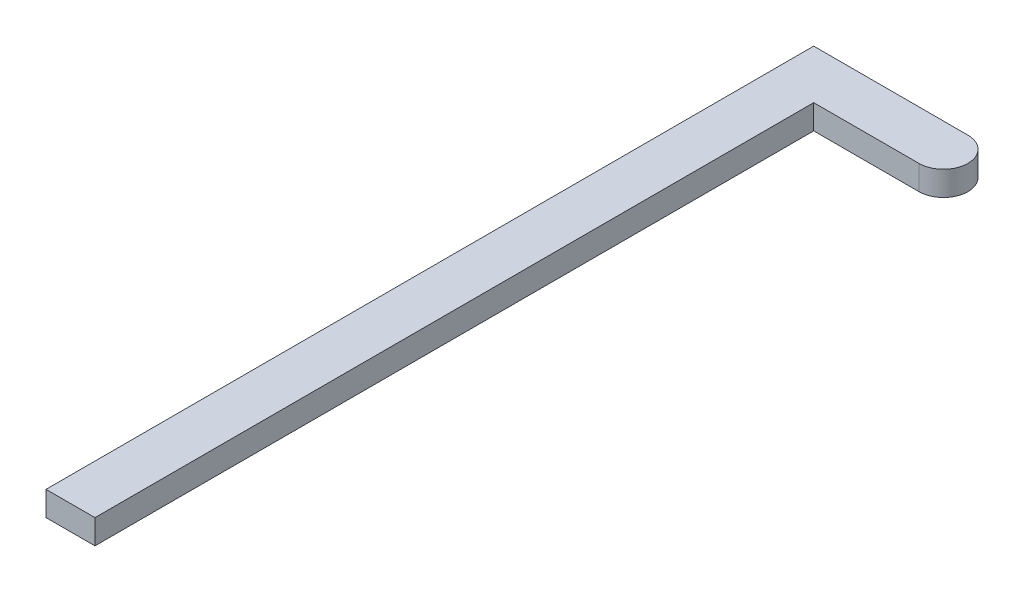
ISO-10303-21;
HEADER;
FILE_DESCRIPTION(('STEP AP214'),'2;1');
FILE_NAME('part.step','',(''),(''),'','','');
FILE_SCHEMA(('AUTOMOTIVE_DESIGN { 1 0 10303 214 1 1 1 1 }'));
ENDSEC;
DATA;
#1=APPLICATION_CONTEXT('core data for automotive mechanical design processes');
#2=APPLICATION_PROTOCOL_DEFINITION('international standard','automotive_design',2000,#1);
#3=PRODUCT_CONTEXT('',#1,'mechanical');
#4=PRODUCT('Part','Part','',(#3));
#5=PRODUCT_RELATED_PRODUCT_CATEGORY('part','',(#4));
#6=PRODUCT_DEFINITION_FORMATION('','',#4);
#7=PRODUCT_DEFINITION_CONTEXT('part definition',#1,'design');
#8=PRODUCT_DEFINITION('design','',#6,#7);
#9=PRODUCT_DEFINITION_SHAPE('','',#8);
#10=(LENGTH_UNIT() NAMED_UNIT(*) SI_UNIT(.MILLI.,.METRE.));
#11=(NAMED_UNIT(*) PLANE_ANGLE_UNIT() SI_UNIT($,.RADIAN.));
#12=(NAMED_UNIT(*) SI_UNIT($,.STERADIAN.) SOLID_ANGLE_UNIT());
#13=UNCERTAINTY_MEASURE_WITH_UNIT(LENGTH_MEASURE(1.E-05),#10,'distance_accuracy_value','');
#14=(GEOMETRIC_REPRESENTATION_CONTEXT(3) GLOBAL_UNCERTAINTY_ASSIGNED_CONTEXT((#13)) GLOBAL_UNIT_ASSIGNED_CONTEXT((#10,
#11,#12)) REPRESENTATION_CONTEXT('',''));
#15=CARTESIAN_POINT('',(0.,0.,0.));
#16=DIRECTION('',(0.,0.,1.));
#17=DIRECTION('',(1.,0.,0.));
#18=AXIS2_PLACEMENT_3D('',#15,#16,#17);
#19=CARTESIAN_POINT('',(0.,6.35,0.));
#20=DIRECTION('',(0.,-1.,0.));
#21=DIRECTION('',(0.,0.,-1.));
#22=AXIS2_PLACEMENT_3D('',#19,#20,#21);
#23=CYLINDRICAL_SURFACE('',#22,6.35);
#24=CARTESIAN_POINT('',(0.,0.,0.));
#25=DIRECTION('',(0.,1.,0.));
#26=DIRECTION('',(0.,0.,-1.));
#27=AXIS2_PLACEMENT_3D('',#24,#25,#26);
#28=CIRCLE('',#27,6.35);
#29=CARTESIAN_POINT('',(0.,0.,6.35));
#30=VERTEX_POINT('',#29);
#31=CARTESIAN_POINT('',(0.,0.,-6.35));
#32=VERTEX_POINT('',#31);
#33=EDGE_CURVE('E117',#30,#32,#28,.T.);
#34=ORIENTED_EDGE('',*,*,#33,.T.);
#35=DIRECTION('',(0.,-1.,0.));
#36=VECTOR('',#35,1.);
#37=CARTESIAN_POINT('',(0.,6.35,-6.35));
#38=LINE('',#37,#36);
#39=CARTESIAN_POINT('',(0.,6.35,-6.35));
#40=VERTEX_POINT('',#39);
#41=EDGE_CURVE('E11',#40,#32,#38,.T.);
#42=ORIENTED_EDGE('',*,*,#41,.F.);
#43=CARTESIAN_POINT('',(0.,6.35,0.));
#44=DIRECTION('',(0.,1.,0.));
#45=DIRECTION('',(0.,0.,-1.));
#46=AXIS2_PLACEMENT_3D('',#43,#44,#45);
#47=CIRCLE('',#46,6.35);
#48=CARTESIAN_POINT('',(0.,6.35,6.35));
#49=VERTEX_POINT('',#48);
#50=EDGE_CURVE('E127',#49,#40,#47,.T.);
#51=ORIENTED_EDGE('',*,*,#50,.F.);
#52=DIRECTION('',(0.,-1.,0.));
#53=VECTOR('',#52,1.);
#54=CARTESIAN_POINT('',(0.,6.35,6.35));
#55=LINE('',#54,#53);
#56=EDGE_CURVE('E113',#49,#30,#55,.T.);
#57=ORIENTED_EDGE('',*,*,#56,.T.);
#58=EDGE_LOOP('',(#34,#42,#51,#57));
#59=FACE_BOUND('',#58,.T.);
#60=ADVANCED_FACE('F33',(#59),#23,.T.);
#61=CARTESIAN_POINT('',(0.,6.35,-6.35));
#62=DIRECTION('',(0.,0.,1.));
#63=DIRECTION('',(1.,0.,0.));
#64=AXIS2_PLACEMENT_3D('',#61,#62,#63);
#65=PLANE('',#64);
#66=DIRECTION('',(-1.,0.,0.));
#67=VECTOR('',#66,1.);
#68=CARTESIAN_POINT('',(0.,0.,-6.35));
#69=LINE('',#68,#67);
#70=CARTESIAN_POINT('',(-40.,0.,-6.35));
#71=VERTEX_POINT('',#70);
#72=EDGE_CURVE('E120',#32,#71,#69,.T.);
#73=ORIENTED_EDGE('',*,*,#72,.T.);
#74=DIRECTION('',(0.,-1.,0.));
#75=VECTOR('',#74,1.);
#76=CARTESIAN_POINT('',(-40.,6.35,-6.35));
#77=LINE('',#76,#75);
#78=CARTESIAN_POINT('',(-40.,6.35,-6.35));
#79=VERTEX_POINT('',#78);
#80=EDGE_CURVE('E41',#79,#71,#77,.T.);
#81=ORIENTED_EDGE('',*,*,#80,.F.);
#82=DIRECTION('',(-1.,0.,0.));
#83=VECTOR('',#82,1.);
#84=CARTESIAN_POINT('',(0.,6.35,-6.35));
#85=LINE('',#84,#83);
#86=EDGE_CURVE('E86',#40,#79,#85,.T.);
#87=ORIENTED_EDGE('',*,*,#86,.F.);
#88=ORIENTED_EDGE('',*,*,#41,.T.);
#89=EDGE_LOOP('',(#73,#81,#87,#88));
#90=FACE_BOUND('',#89,.T.);
#91=ADVANCED_FACE('F151',(#90),#65,.F.);
#92=CARTESIAN_POINT('',(-40.,6.35,-6.35));
#93=DIRECTION('',(1.,0.,0.));
#94=DIRECTION('',(0.,0.,-1.));
#95=AXIS2_PLACEMENT_3D('',#92,#93,#94);
#96=PLANE('',#95);
#97=DIRECTION('',(0.,0.,1.));
#98=VECTOR('',#97,1.);
#99=CARTESIAN_POINT('',(-40.,0.,-6.35));
#100=LINE('',#99,#98);
#101=CARTESIAN_POINT('',(-40.,0.,192.786));
#102=VERTEX_POINT('',#101);
#103=EDGE_CURVE('E122',#71,#102,#100,.T.);
#104=ORIENTED_EDGE('',*,*,#103,.T.);
#105=DIRECTION('',(0.,-1.,0.));
#106=VECTOR('',#105,1.);
#107=CARTESIAN_POINT('',(-40.,6.35,192.786));
#108=LINE('',#107,#106);
#109=CARTESIAN_POINT('',(-40.,6.35,192.786));
#110=VERTEX_POINT('',#109);
#111=EDGE_CURVE('E108',#110,#102,#108,.T.);
#112=ORIENTED_EDGE('',*,*,#111,.F.);
#113=DIRECTION('',(0.,0.,1.));
#114=VECTOR('',#113,1.);
#115=CARTESIAN_POINT('',(-40.,6.35,-6.35));
#116=LINE('',#115,#114);
#117=EDGE_CURVE('E99',#79,#110,#116,.T.);
#118=ORIENTED_EDGE('',*,*,#117,.F.);
#119=ORIENTED_EDGE('',*,*,#80,.T.);
#120=EDGE_LOOP('',(#104,#112,#118,#119));
#121=FACE_BOUND('',#120,.T.);
#122=ADVANCED_FACE('F133',(#121),#96,.F.);
#123=CARTESIAN_POINT('',(-40.,6.35,192.786));
#124=DIRECTION('',(0.,0.,-1.));
#125=DIRECTION('',(-1.,0.,0.));
#126=AXIS2_PLACEMENT_3D('',#123,#124,#125);
#127=PLANE('',#126);
#128=DIRECTION('',(1.,0.,0.));
#129=VECTOR('',#128,1.);
#130=CARTESIAN_POINT('',(-40.,0.,192.786));
#131=LINE('',#130,#129);
#132=CARTESIAN_POINT('',(-27.3,0.,192.786));
#133=VERTEX_POINT('',#132);
#134=EDGE_CURVE('E107',#102,#133,#131,.T.);
#135=ORIENTED_EDGE('',*,*,#134,.T.);
#136=DIRECTION('',(0.,-1.,0.));
#137=VECTOR('',#136,1.);
#138=CARTESIAN_POINT('',(-27.3,6.35,192.786));
#139=LINE('',#138,#137);
#140=CARTESIAN_POINT('',(-27.3,6.35,192.786));
#141=VERTEX_POINT('',#140);
#142=EDGE_CURVE('E104',#141,#133,#139,.T.);
#143=ORIENTED_EDGE('',*,*,#142,.F.);
#144=DIRECTION('',(1.,0.,0.));
#145=VECTOR('',#144,1.);
#146=CARTESIAN_POINT('',(-40.,6.35,192.786));
#147=LINE('',#146,#145);
#148=EDGE_CURVE('E93',#110,#141,#147,.T.);
#149=ORIENTED_EDGE('',*,*,#148,.F.);
#150=ORIENTED_EDGE('',*,*,#111,.T.);
#151=EDGE_LOOP('',(#135,#143,#149,#150));
#152=FACE_BOUND('',#151,.T.);
#153=ADVANCED_FACE('F105',(#152),#127,.F.);
#154=CARTESIAN_POINT('',(-27.3,6.35,6.35));
#155=DIRECTION('',(-1.,0.,0.));
#156=DIRECTION('',(0.,0.,1.));
#157=AXIS2_PLACEMENT_3D('',#154,#155,#156);
#158=PLANE('',#157);
#159=DIRECTION('',(0.,0.,-1.));
#160=VECTOR('',#159,1.);
#161=CARTESIAN_POINT('',(-27.3,0.,6.35));
#162=LINE('',#161,#160);
#163=CARTESIAN_POINT('',(-27.3,0.,6.35));
#164=VERTEX_POINT('',#163);
#165=EDGE_CURVE('E72',#133,#164,#162,.T.);
#166=ORIENTED_EDGE('',*,*,#165,.T.);
#167=DIRECTION('',(0.,-1.,0.));
#168=VECTOR('',#167,1.);
#169=CARTESIAN_POINT('',(-27.3,6.35,6.35));
#170=LINE('',#169,#168);
#171=CARTESIAN_POINT('',(-27.3,6.35,6.35));
#172=VERTEX_POINT('',#171);
#173=EDGE_CURVE('E109',#172,#164,#170,.T.);
#174=ORIENTED_EDGE('',*,*,#173,.F.);
#175=DIRECTION('',(0.,0.,-1.));
#176=VECTOR('',#175,1.);
#177=CARTESIAN_POINT('',(-27.3,6.35,6.35));
#178=LINE('',#177,#176);
#179=EDGE_CURVE('E97',#141,#172,#178,.T.);
#180=ORIENTED_EDGE('',*,*,#179,.F.);
#181=ORIENTED_EDGE('',*,*,#142,.T.);
#182=EDGE_LOOP('',(#166,#174,#180,#181));
#183=FACE_BOUND('',#182,.T.);
#184=ADVANCED_FACE('F111',(#183),#158,.F.);
#185=CARTESIAN_POINT('',(0.,6.35,6.35));
#186=DIRECTION('',(0.,0.,-1.));
#187=DIRECTION('',(-1.,0.,0.));
#188=AXIS2_PLACEMENT_3D('',#185,#186,#187);
#189=PLANE('',#188);
#190=DIRECTION('',(1.,0.,0.));
#191=VECTOR('',#190,1.);
#192=CARTESIAN_POINT('',(0.,0.,6.35));
#193=LINE('',#192,#191);
#194=EDGE_CURVE('E78',#164,#30,#193,.T.);
#195=ORIENTED_EDGE('',*,*,#194,.T.);
#196=ORIENTED_EDGE('',*,*,#56,.F.);
#197=DIRECTION('',(1.,0.,0.));
#198=VECTOR('',#197,1.);
#199=CARTESIAN_POINT('',(0.,6.35,6.35));
#200=LINE('',#199,#198);
#201=EDGE_CURVE('E49',#172,#49,#200,.T.);
#202=ORIENTED_EDGE('',*,*,#201,.F.);
#203=ORIENTED_EDGE('',*,*,#173,.T.);
#204=EDGE_LOOP('',(#195,#196,#202,#203));
#205=FACE_BOUND('',#204,.T.);
#206=ADVANCED_FACE('F140',(#205),#189,.F.);
#207=CARTESIAN_POINT('',(0.,6.35,0.));
#208=DIRECTION('',(0.,-1.,0.));
#209=DIRECTION('',(0.,0.,-1.));
#210=AXIS2_PLACEMENT_3D('',#207,#208,#209);
#211=PLANE('',#210);
#212=ORIENTED_EDGE('',*,*,#50,.T.);
#213=ORIENTED_EDGE('',*,*,#86,.T.);
#214=ORIENTED_EDGE('',*,*,#117,.T.);
#215=ORIENTED_EDGE('',*,*,#148,.T.);
#216=ORIENTED_EDGE('',*,*,#179,.T.);
#217=ORIENTED_EDGE('',*,*,#201,.T.);
#218=EDGE_LOOP('',(#212,#213,#214,#215,#216,#217));
#219=FACE_BOUND('',#218,.T.);
#220=ADVANCED_FACE('F95',(#219),#211,.F.);
#221=CARTESIAN_POINT('',(0.,0.,0.));
#222=DIRECTION('',(0.,-1.,0.));
#223=DIRECTION('',(0.,0.,-1.));
#224=AXIS2_PLACEMENT_3D('',#221,#222,#223);
#225=PLANE('',#224);
#226=ORIENTED_EDGE('',*,*,#33,.F.);
#227=ORIENTED_EDGE('',*,*,#194,.F.);
#228=ORIENTED_EDGE('',*,*,#165,.F.);
#229=ORIENTED_EDGE('',*,*,#134,.F.);
#230=ORIENTED_EDGE('',*,*,#103,.F.);
#231=ORIENTED_EDGE('',*,*,#72,.F.);
#232=EDGE_LOOP('',(#226,#227,#228,#229,#230,#231));
#233=FACE_BOUND('',#232,.T.);
#234=ADVANCED_FACE('F136',(#233),#225,.T.);
#235=CLOSED_SHELL('',(#60,#91,#122,#153,#184,#206,#220,#234));
#236=MANIFOLD_SOLID_BREP('B2',#235);
#237=ADVANCED_BREP_SHAPE_REPRESENTATION('',(#18,#236),#14);
#238=SHAPE_DEFINITION_REPRESENTATION(#9,#237);
ENDSEC;
END-ISO-10303-21;
